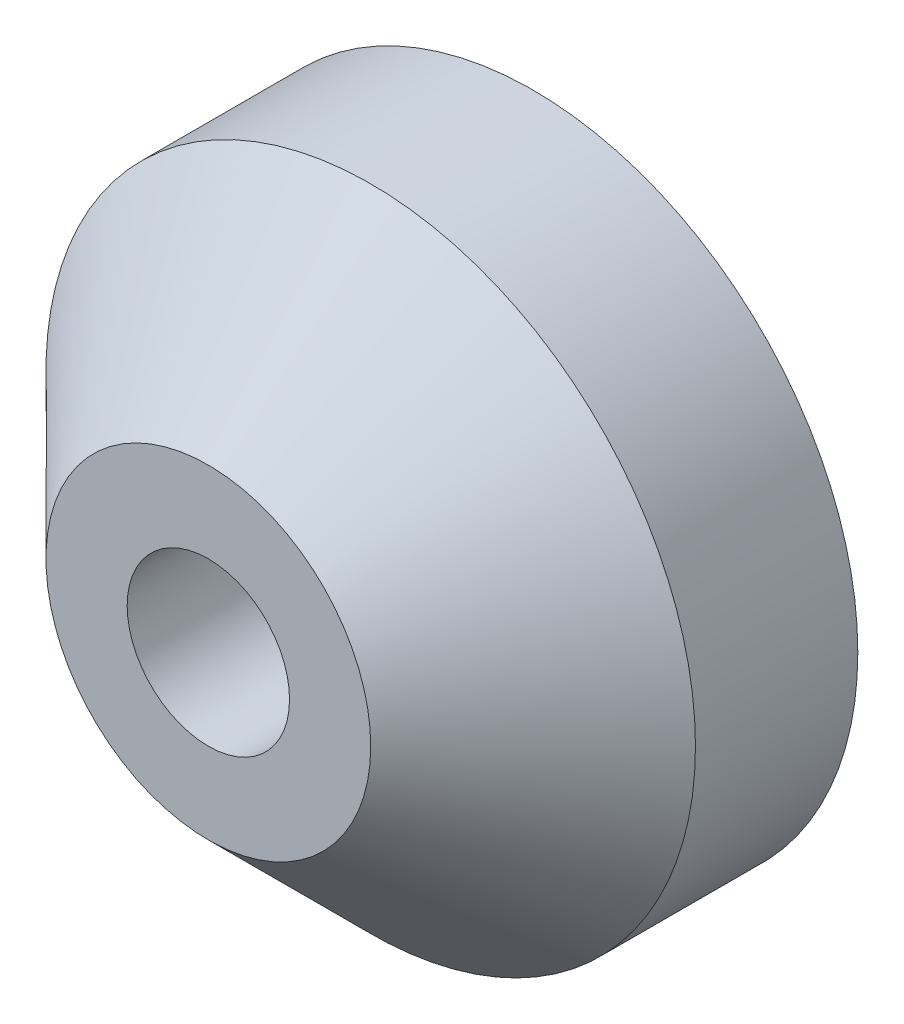
ISO-10303-21;
HEADER;
FILE_DESCRIPTION(('STEP AP214'),'2;1');
FILE_NAME('part.step','',(''),(''),'','','');
FILE_SCHEMA(('AUTOMOTIVE_DESIGN { 1 0 10303 214 1 1 1 1 }'));
ENDSEC;
DATA;
#1=APPLICATION_CONTEXT('core data for automotive mechanical design processes');
#2=APPLICATION_PROTOCOL_DEFINITION('international standard','automotive_design',2000,#1);
#3=PRODUCT_CONTEXT('',#1,'mechanical');
#4=PRODUCT('Part','Part','',(#3));
#5=PRODUCT_RELATED_PRODUCT_CATEGORY('part','',(#4));
#6=PRODUCT_DEFINITION_FORMATION('','',#4);
#7=PRODUCT_DEFINITION_CONTEXT('part definition',#1,'design');
#8=PRODUCT_DEFINITION('design','',#6,#7);
#9=PRODUCT_DEFINITION_SHAPE('','',#8);
#10=(LENGTH_UNIT() NAMED_UNIT(*) SI_UNIT(.MILLI.,.METRE.));
#11=(NAMED_UNIT(*) PLANE_ANGLE_UNIT() SI_UNIT($,.RADIAN.));
#12=(NAMED_UNIT(*) SI_UNIT($,.STERADIAN.) SOLID_ANGLE_UNIT());
#13=UNCERTAINTY_MEASURE_WITH_UNIT(LENGTH_MEASURE(1.E-05),#10,'distance_accuracy_value','');
#14=(GEOMETRIC_REPRESENTATION_CONTEXT(3) GLOBAL_UNCERTAINTY_ASSIGNED_CONTEXT((#13)) GLOBAL_UNIT_ASSIGNED_CONTEXT((#10,
#11,#12)) REPRESENTATION_CONTEXT('',''));
#15=CARTESIAN_POINT('',(0.,0.,0.));
#16=DIRECTION('',(0.,0.,1.));
#17=DIRECTION('',(1.,0.,0.));
#18=AXIS2_PLACEMENT_3D('',#15,#16,#17);
#19=CARTESIAN_POINT('',(0.,0.,5.));
#20=DIRECTION('',(0.,0.,-1.));
#21=DIRECTION('',(-1.,0.,0.));
#22=AXIS2_PLACEMENT_3D('',#19,#20,#21);
#23=CYLINDRICAL_SURFACE('',#22,1.25);
#24=CARTESIAN_POINT('',(0.,0.,5.));
#25=DIRECTION('',(0.,0.,1.));
#26=DIRECTION('',(1.,0.,0.));
#27=AXIS2_PLACEMENT_3D('',#24,#25,#26);
#28=CIRCLE('',#27,1.25);
#29=CARTESIAN_POINT('',(1.25,0.,5.));
#30=VERTEX_POINT('',#29);
#31=EDGE_CURVE('E53',#30,#30,#28,.T.);
#32=ORIENTED_EDGE('',*,*,#31,.T.);
#33=EDGE_LOOP('',(#32));
#34=FACE_BOUND('',#33,.T.);
#35=CARTESIAN_POINT('',(0.,0.,2.));
#36=DIRECTION('',(0.,0.,-1.));
#37=DIRECTION('',(-1.,0.,0.));
#38=AXIS2_PLACEMENT_3D('',#35,#36,#37);
#39=CIRCLE('',#38,1.25);
#40=CARTESIAN_POINT('',(-1.25,0.,2.));
#41=VERTEX_POINT('',#40);
#42=EDGE_CURVE('E40',#41,#41,#39,.T.);
#43=ORIENTED_EDGE('',*,*,#42,.T.);
#44=EDGE_LOOP('',(#43));
#45=FACE_BOUND('',#44,.T.);
#46=ADVANCED_FACE('F35',(#34,#45),#23,.F.);
#47=CARTESIAN_POINT('',(0.,0.,5.));
#48=DIRECTION('',(0.,0.,1.));
#49=DIRECTION('',(1.,0.,0.));
#50=AXIS2_PLACEMENT_3D('',#47,#48,#49);
#51=PLANE('',#50);
#52=CARTESIAN_POINT('',(0.,0.,5.));
#53=DIRECTION('',(0.,0.,1.));
#54=DIRECTION('',(1.,0.,0.));
#55=AXIS2_PLACEMENT_3D('',#52,#53,#54);
#56=CIRCLE('',#55,2.5);
#57=CARTESIAN_POINT('',(2.5,0.,5.));
#58=VERTEX_POINT('',#57);
#59=EDGE_CURVE('E44',#58,#58,#56,.T.);
#60=ORIENTED_EDGE('',*,*,#59,.T.);
#61=EDGE_LOOP('',(#60));
#62=FACE_BOUND('',#61,.T.);
#63=ORIENTED_EDGE('',*,*,#31,.F.);
#64=EDGE_LOOP('',(#63));
#65=FACE_BOUND('',#64,.T.);
#66=ADVANCED_FACE('F77',(#62,#65),#51,.T.);
#67=CARTESIAN_POINT('',(0.,0.,0.));
#68=DIRECTION('',(0.,0.,1.));
#69=DIRECTION('',(1.,0.,0.));
#70=AXIS2_PLACEMENT_3D('',#67,#68,#69);
#71=PLANE('',#70);
#72=CARTESIAN_POINT('',(0.,0.,0.));
#73=DIRECTION('',(0.,0.,-1.));
#74=DIRECTION('',(-1.,0.,0.));
#75=AXIS2_PLACEMENT_3D('',#72,#73,#74);
#76=CIRCLE('',#75,2.5);
#77=CARTESIAN_POINT('',(-2.5,0.,0.));
#78=VERTEX_POINT('',#77);
#79=EDGE_CURVE('E56',#78,#78,#76,.T.);
#80=ORIENTED_EDGE('',*,*,#79,.F.);
#81=EDGE_LOOP('',(#80));
#82=FACE_BOUND('',#81,.T.);
#83=CARTESIAN_POINT('',(0.,0.,0.));
#84=DIRECTION('',(0.,0.,1.));
#85=DIRECTION('',(1.,0.,0.));
#86=AXIS2_PLACEMENT_3D('',#83,#84,#85);
#87=CIRCLE('',#86,5.);
#88=CARTESIAN_POINT('',(5.,0.,0.));
#89=VERTEX_POINT('',#88);
#90=EDGE_CURVE('E48',#89,#89,#87,.T.);
#91=ORIENTED_EDGE('',*,*,#90,.F.);
#92=EDGE_LOOP('',(#91));
#93=FACE_BOUND('',#92,.T.);
#94=ADVANCED_FACE('F83',(#82,#93),#71,.F.);
#95=CARTESIAN_POINT('',(0.,0.,5.));
#96=DIRECTION('',(0.,0.,-1.));
#97=DIRECTION('',(-1.,0.,0.));
#98=AXIS2_PLACEMENT_3D('',#95,#96,#97);
#99=CYLINDRICAL_SURFACE('',#98,5.);
#100=CARTESIAN_POINT('',(0.,0.,2.49999999999999));
#101=DIRECTION('',(0.,0.,1.));
#102=DIRECTION('',(1.,0.,0.));
#103=AXIS2_PLACEMENT_3D('',#100,#101,#102);
#104=CIRCLE('',#103,5.);
#105=CARTESIAN_POINT('',(5.,0.,2.49999999999999));
#106=VERTEX_POINT('',#105);
#107=EDGE_CURVE('E10',#106,#106,#104,.F.);
#108=ORIENTED_EDGE('',*,*,#107,.T.);
#109=EDGE_LOOP('',(#108));
#110=FACE_BOUND('',#109,.T.);
#111=ORIENTED_EDGE('',*,*,#90,.T.);
#112=EDGE_LOOP('',(#111));
#113=FACE_BOUND('',#112,.T.);
#114=ADVANCED_FACE('F88',(#110,#113),#99,.T.);
#115=CARTESIAN_POINT('',(0.,0.,5.));
#116=DIRECTION('',(0.,0.,-1.));
#117=DIRECTION('',(-1.,0.,0.));
#118=AXIS2_PLACEMENT_3D('',#115,#116,#117);
#119=CONICAL_SURFACE('',#118,2.5,0.785398163397447);
#120=ORIENTED_EDGE('',*,*,#107,.F.);
#121=EDGE_LOOP('',(#120));
#122=FACE_BOUND('',#121,.T.);
#123=ORIENTED_EDGE('',*,*,#59,.F.);
#124=EDGE_LOOP('',(#123));
#125=FACE_BOUND('',#124,.T.);
#126=ADVANCED_FACE('F38',(#122,#125),#119,.T.);
#127=CARTESIAN_POINT('',(0.,0.,2.));
#128=DIRECTION('',(0.,0.,-1.));
#129=DIRECTION('',(-1.,0.,0.));
#130=AXIS2_PLACEMENT_3D('',#127,#128,#129);
#131=CYLINDRICAL_SURFACE('',#130,2.5);
#132=CARTESIAN_POINT('',(0.,0.,2.));
#133=DIRECTION('',(0.,0.,-1.));
#134=DIRECTION('',(-1.,0.,0.));
#135=AXIS2_PLACEMENT_3D('',#132,#133,#134);
#136=CIRCLE('',#135,2.5);
#137=CARTESIAN_POINT('',(-2.5,0.,2.));
#138=VERTEX_POINT('',#137);
#139=EDGE_CURVE('E59',#138,#138,#136,.T.);
#140=ORIENTED_EDGE('',*,*,#139,.F.);
#141=EDGE_LOOP('',(#140));
#142=FACE_BOUND('',#141,.T.);
#143=ORIENTED_EDGE('',*,*,#79,.T.);
#144=EDGE_LOOP('',(#143));
#145=FACE_BOUND('',#144,.T.);
#146=ADVANCED_FACE('F69',(#142,#145),#131,.F.);
#147=CARTESIAN_POINT('',(0.,0.,2.));
#148=DIRECTION('',(0.,0.,-1.));
#149=DIRECTION('',(-1.,0.,0.));
#150=AXIS2_PLACEMENT_3D('',#147,#148,#149);
#151=PLANE('',#150);
#152=ORIENTED_EDGE('',*,*,#42,.F.);
#153=EDGE_LOOP('',(#152));
#154=FACE_BOUND('',#153,.T.);
#155=ORIENTED_EDGE('',*,*,#139,.T.);
#156=EDGE_LOOP('',(#155));
#157=FACE_BOUND('',#156,.T.);
#158=ADVANCED_FACE('F67',(#154,#157),#151,.T.);
#159=CLOSED_SHELL('',(#46,#66,#94,#114,#126,#146,#158));
#160=MANIFOLD_SOLID_BREP('B2',#159);
#161=ADVANCED_BREP_SHAPE_REPRESENTATION('',(#18,#160),#14);
#162=SHAPE_DEFINITION_REPRESENTATION(#9,#161);
ENDSEC;
END-ISO-10303-21;
